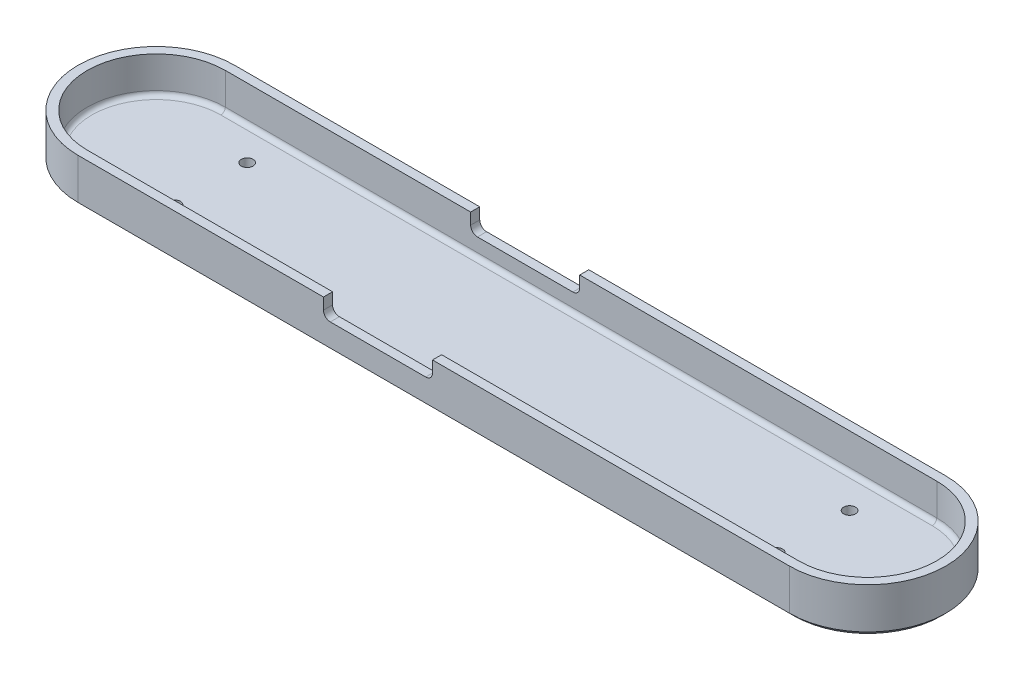
ISO-10303-21;
HEADER;
FILE_DESCRIPTION(('STEP AP214'),'2;1');
FILE_NAME('part.step','',(''),(''),'','','');
FILE_SCHEMA(('AUTOMOTIVE_DESIGN { 1 0 10303 214 1 1 1 1 }'));
ENDSEC;
DATA;
#1=APPLICATION_CONTEXT('core data for automotive mechanical design processes');
#2=APPLICATION_PROTOCOL_DEFINITION('international standard','automotive_design',2000,#1);
#3=PRODUCT_CONTEXT('',#1,'mechanical');
#4=PRODUCT('Part','Part','',(#3));
#5=PRODUCT_RELATED_PRODUCT_CATEGORY('part','',(#4));
#6=PRODUCT_DEFINITION_FORMATION('','',#4);
#7=PRODUCT_DEFINITION_CONTEXT('part definition',#1,'design');
#8=PRODUCT_DEFINITION('design','',#6,#7);
#9=PRODUCT_DEFINITION_SHAPE('','',#8);
#10=(LENGTH_UNIT() NAMED_UNIT(*) SI_UNIT(.MILLI.,.METRE.));
#11=(NAMED_UNIT(*) PLANE_ANGLE_UNIT() SI_UNIT($,.RADIAN.));
#12=(NAMED_UNIT(*) SI_UNIT($,.STERADIAN.) SOLID_ANGLE_UNIT());
#13=UNCERTAINTY_MEASURE_WITH_UNIT(LENGTH_MEASURE(1.E-05),#10,'distance_accuracy_value','');
#14=(GEOMETRIC_REPRESENTATION_CONTEXT(3) GLOBAL_UNCERTAINTY_ASSIGNED_CONTEXT((#13)) GLOBAL_UNIT_ASSIGNED_CONTEXT((#10,
#11,#12)) REPRESENTATION_CONTEXT('',''));
#15=CARTESIAN_POINT('',(0.,0.,0.));
#16=DIRECTION('',(0.,0.,1.));
#17=DIRECTION('',(1.,0.,0.));
#18=AXIS2_PLACEMENT_3D('',#15,#16,#17);
#19=CARTESIAN_POINT('',(-99.441,12.7,21.844));
#20=DIRECTION('',(0.,0.,1.));
#21=DIRECTION('',(1.,0.,0.));
#22=AXIS2_PLACEMENT_3D('',#19,#20,#21);
#23=PLANE('',#22);
#24=DIRECTION('',(0.,1.,0.));
#25=VECTOR('',#24,1.);
#26=CARTESIAN_POINT('',(-0.380999999999999,7.62,21.844));
#27=LINE('',#26,#25);
#28=CARTESIAN_POINT('',(-0.380999999999999,9.525,21.844));
#29=VERTEX_POINT('',#28);
#30=CARTESIAN_POINT('',(-0.380999999999999,12.7,21.844));
#31=VERTEX_POINT('',#30);
#32=EDGE_CURVE('E210',#29,#31,#27,.T.);
#33=ORIENTED_EDGE('',*,*,#32,.F.);
#34=CARTESIAN_POINT('',(-2.286,9.525,21.844));
#35=DIRECTION('',(0.,0.,1.));
#36=DIRECTION('',(1.,0.,0.));
#37=AXIS2_PLACEMENT_3D('',#34,#35,#36);
#38=CIRCLE('',#37,1.905);
#39=CARTESIAN_POINT('',(-2.286,7.62,21.844));
#40=VERTEX_POINT('',#39);
#41=EDGE_CURVE('E373',#29,#40,#38,.F.);
#42=ORIENTED_EDGE('',*,*,#41,.T.);
#43=DIRECTION('',(-1.,0.,0.));
#44=VECTOR('',#43,1.);
#45=CARTESIAN_POINT('',(-0.380999999999999,7.62,21.844));
#46=LINE('',#45,#44);
#47=CARTESIAN_POINT('',(-28.956,7.62,21.844));
#48=VERTEX_POINT('',#47);
#49=EDGE_CURVE('E550',#40,#48,#46,.T.);
#50=ORIENTED_EDGE('',*,*,#49,.T.);
#51=CARTESIAN_POINT('',(-28.956,9.525,21.844));
#52=DIRECTION('',(0.,0.,1.));
#53=DIRECTION('',(1.,0.,0.));
#54=AXIS2_PLACEMENT_3D('',#51,#52,#53);
#55=CIRCLE('',#54,1.905);
#56=CARTESIAN_POINT('',(-30.861,9.525,21.844));
#57=VERTEX_POINT('',#56);
#58=EDGE_CURVE('E370',#48,#57,#55,.F.);
#59=ORIENTED_EDGE('',*,*,#58,.T.);
#60=DIRECTION('',(0.,1.,0.));
#61=VECTOR('',#60,1.);
#62=CARTESIAN_POINT('',(-30.861,7.62,21.844));
#63=LINE('',#62,#61);
#64=CARTESIAN_POINT('',(-30.861,12.7,21.844));
#65=VERTEX_POINT('',#64);
#66=EDGE_CURVE('E537',#57,#65,#63,.T.);
#67=ORIENTED_EDGE('',*,*,#66,.T.);
#68=DIRECTION('',(-1.,0.,0.));
#69=VECTOR('',#68,1.);
#70=CARTESIAN_POINT('',(-99.441,12.7,21.844));
#71=LINE('',#70,#69);
#72=CARTESIAN_POINT('',(-99.441,12.7,21.844));
#73=VERTEX_POINT('',#72);
#74=EDGE_CURVE('E241',#65,#73,#71,.T.);
#75=ORIENTED_EDGE('',*,*,#74,.T.);
#76=DIRECTION('',(0.,-1.,0.));
#77=VECTOR('',#76,1.);
#78=CARTESIAN_POINT('',(-99.441,12.7,21.844));
#79=LINE('',#78,#77);
#80=CARTESIAN_POINT('',(-99.441,1.26999999999999,21.844));
#81=VERTEX_POINT('',#80);
#82=EDGE_CURVE('E252',#73,#81,#79,.T.);
#83=ORIENTED_EDGE('',*,*,#82,.T.);
#84=DIRECTION('',(1.,0.,0.));
#85=VECTOR('',#84,1.);
#86=CARTESIAN_POINT('',(99.441,1.26999999999999,21.844));
#87=LINE('',#86,#85);
#88=CARTESIAN_POINT('',(99.441,1.26999999999999,21.844));
#89=VERTEX_POINT('',#88);
#90=EDGE_CURVE('E316',#81,#89,#87,.T.);
#91=ORIENTED_EDGE('',*,*,#90,.T.);
#92=DIRECTION('',(0.,-1.,0.));
#93=VECTOR('',#92,1.);
#94=CARTESIAN_POINT('',(99.441,12.7,21.844));
#95=LINE('',#94,#93);
#96=CARTESIAN_POINT('',(99.441,12.7,21.844));
#97=VERTEX_POINT('',#96);
#98=EDGE_CURVE('E237',#97,#89,#95,.T.);
#99=ORIENTED_EDGE('',*,*,#98,.F.);
#100=EDGE_CURVE('E228',#97,#31,#71,.T.);
#101=ORIENTED_EDGE('',*,*,#100,.T.);
#102=EDGE_LOOP('',(#33,#42,#50,#59,#67,#75,#83,#91,#99,#101));
#103=FACE_BOUND('',#102,.T.);
#104=ADVANCED_FACE('F49',(#103),#23,.T.);
#105=CARTESIAN_POINT('',(-99.441,12.7,0.));
#106=DIRECTION('',(0.,-1.,0.));
#107=DIRECTION('',(0.,0.,-1.));
#108=AXIS2_PLACEMENT_3D('',#105,#106,#107);
#109=PLANE('',#108);
#110=DIRECTION('',(0.,0.,-1.));
#111=VECTOR('',#110,1.);
#112=CARTESIAN_POINT('',(-30.861,12.7,21.844));
#113=LINE('',#112,#111);
#114=CARTESIAN_POINT('',(-30.861,12.7,19.304));
#115=VERTEX_POINT('',#114);
#116=EDGE_CURVE('E233',#65,#115,#113,.T.);
#117=ORIENTED_EDGE('',*,*,#116,.T.);
#118=DIRECTION('',(-1.,0.,0.));
#119=VECTOR('',#118,1.);
#120=CARTESIAN_POINT('',(99.441,12.7,19.304));
#121=LINE('',#120,#119);
#122=CARTESIAN_POINT('',(-99.441,12.7,19.304));
#123=VERTEX_POINT('',#122);
#124=EDGE_CURVE('E469',#115,#123,#121,.T.);
#125=ORIENTED_EDGE('',*,*,#124,.T.);
#126=CARTESIAN_POINT('',(-99.441,12.7,0.));
#127=DIRECTION('',(0.,-1.,0.));
#128=DIRECTION('',(0.,0.,-1.));
#129=AXIS2_PLACEMENT_3D('',#126,#127,#128);
#130=CIRCLE('',#129,19.304);
#131=CARTESIAN_POINT('',(-99.441,12.7,-19.304));
#132=VERTEX_POINT('',#131);
#133=EDGE_CURVE('E457',#123,#132,#130,.T.);
#134=ORIENTED_EDGE('',*,*,#133,.T.);
#135=DIRECTION('',(1.,0.,0.));
#136=VECTOR('',#135,1.);
#137=CARTESIAN_POINT('',(99.441,12.7,-19.304));
#138=LINE('',#137,#136);
#139=CARTESIAN_POINT('',(-30.861,12.7,-19.304));
#140=VERTEX_POINT('',#139);
#141=EDGE_CURVE('E462',#132,#140,#138,.T.);
#142=ORIENTED_EDGE('',*,*,#141,.T.);
#143=DIRECTION('',(0.,0.,1.));
#144=VECTOR('',#143,1.);
#145=CARTESIAN_POINT('',(-30.861,12.7,-21.844));
#146=LINE('',#145,#144);
#147=CARTESIAN_POINT('',(-30.861,12.7,-21.844));
#148=VERTEX_POINT('',#147);
#149=EDGE_CURVE('E534',#148,#140,#146,.T.);
#150=ORIENTED_EDGE('',*,*,#149,.F.);
#151=DIRECTION('',(1.,0.,0.));
#152=VECTOR('',#151,1.);
#153=CARTESIAN_POINT('',(-99.441,12.7,-21.844));
#154=LINE('',#153,#152);
#155=CARTESIAN_POINT('',(-99.441,12.7,-21.844));
#156=VERTEX_POINT('',#155);
#157=EDGE_CURVE('E492',#156,#148,#154,.T.);
#158=ORIENTED_EDGE('',*,*,#157,.F.);
#159=CARTESIAN_POINT('',(-99.441,12.7,0.));
#160=DIRECTION('',(0.,-1.,0.));
#161=DIRECTION('',(0.,0.,-1.));
#162=AXIS2_PLACEMENT_3D('',#159,#160,#161);
#163=CIRCLE('',#162,21.844);
#164=EDGE_CURVE('E477',#73,#156,#163,.T.);
#165=ORIENTED_EDGE('',*,*,#164,.F.);
#166=ORIENTED_EDGE('',*,*,#74,.F.);
#167=EDGE_LOOP('',(#117,#125,#134,#142,#150,#158,#165,#166));
#168=FACE_BOUND('',#167,.T.);
#169=ADVANCED_FACE('F531',(#168),#109,.F.);
#170=DIRECTION('',(0.,0.,1.));
#171=VECTOR('',#170,1.);
#172=CARTESIAN_POINT('',(-0.381000000000006,12.7,19.304));
#173=LINE('',#172,#171);
#174=CARTESIAN_POINT('',(-0.381000000000006,12.7,19.304));
#175=VERTEX_POINT('',#174);
#176=EDGE_CURVE('E214',#175,#31,#173,.T.);
#177=ORIENTED_EDGE('',*,*,#176,.T.);
#178=ORIENTED_EDGE('',*,*,#100,.F.);
#179=CARTESIAN_POINT('',(99.441,12.7,0.));
#180=DIRECTION('',(0.,-1.,0.));
#181=DIRECTION('',(0.,0.,1.));
#182=AXIS2_PLACEMENT_3D('',#179,#180,#181);
#183=CIRCLE('',#182,21.844);
#184=CARTESIAN_POINT('',(99.441,12.7,-21.844));
#185=VERTEX_POINT('',#184);
#186=EDGE_CURVE('E248',#185,#97,#183,.T.);
#187=ORIENTED_EDGE('',*,*,#186,.F.);
#188=CARTESIAN_POINT('',(-0.380999999999999,12.7,-21.844));
#189=VERTEX_POINT('',#188);
#190=EDGE_CURVE('E491',#189,#185,#154,.T.);
#191=ORIENTED_EDGE('',*,*,#190,.F.);
#192=DIRECTION('',(0.,0.,-1.));
#193=VECTOR('',#192,1.);
#194=CARTESIAN_POINT('',(-0.381000000000006,12.7,-19.304));
#195=LINE('',#194,#193);
#196=CARTESIAN_POINT('',(-0.381000000000006,12.7,-19.304));
#197=VERTEX_POINT('',#196);
#198=EDGE_CURVE('E412',#197,#189,#195,.T.);
#199=ORIENTED_EDGE('',*,*,#198,.F.);
#200=CARTESIAN_POINT('',(99.441,12.7,-19.304));
#201=VERTEX_POINT('',#200);
#202=EDGE_CURVE('E461',#197,#201,#138,.T.);
#203=ORIENTED_EDGE('',*,*,#202,.T.);
#204=CARTESIAN_POINT('',(99.441,12.7,0.));
#205=DIRECTION('',(0.,-1.,0.));
#206=DIRECTION('',(0.,0.,1.));
#207=AXIS2_PLACEMENT_3D('',#204,#205,#206);
#208=CIRCLE('',#207,19.304);
#209=CARTESIAN_POINT('',(99.441,12.7,19.304));
#210=VERTEX_POINT('',#209);
#211=EDGE_CURVE('E466',#201,#210,#208,.T.);
#212=ORIENTED_EDGE('',*,*,#211,.T.);
#213=EDGE_CURVE('E231',#210,#175,#121,.T.);
#214=ORIENTED_EDGE('',*,*,#213,.T.);
#215=EDGE_LOOP('',(#177,#178,#187,#191,#199,#203,#212,#214));
#216=FACE_BOUND('',#215,.T.);
#217=ADVANCED_FACE('F226',(#216),#109,.F.);
#218=CARTESIAN_POINT('',(99.441,12.7,19.304));
#219=DIRECTION('',(0.,0.,1.));
#220=DIRECTION('',(1.,0.,0.));
#221=AXIS2_PLACEMENT_3D('',#218,#219,#220);
#222=PLANE('',#221);
#223=DIRECTION('',(0.,1.,0.));
#224=VECTOR('',#223,1.);
#225=CARTESIAN_POINT('',(-30.861,7.62,19.304));
#226=LINE('',#225,#224);
#227=CARTESIAN_POINT('',(-30.861,9.525,19.304));
#228=VERTEX_POINT('',#227);
#229=EDGE_CURVE('E540',#228,#115,#226,.T.);
#230=ORIENTED_EDGE('',*,*,#229,.F.);
#231=CARTESIAN_POINT('',(-28.956,9.525,19.304));
#232=DIRECTION('',(0.,0.,1.));
#233=DIRECTION('',(1.,0.,0.));
#234=AXIS2_PLACEMENT_3D('',#231,#232,#233);
#235=CIRCLE('',#234,1.905);
#236=CARTESIAN_POINT('',(-28.956,7.62,19.304));
#237=VERTEX_POINT('',#236);
#238=EDGE_CURVE('E367',#228,#237,#235,.T.);
#239=ORIENTED_EDGE('',*,*,#238,.T.);
#240=DIRECTION('',(1.,0.,0.));
#241=VECTOR('',#240,1.);
#242=CARTESIAN_POINT('',(-30.861,7.62,19.304));
#243=LINE('',#242,#241);
#244=CARTESIAN_POINT('',(-2.28600000000001,7.62,19.304));
#245=VERTEX_POINT('',#244);
#246=EDGE_CURVE('E222',#237,#245,#243,.T.);
#247=ORIENTED_EDGE('',*,*,#246,.T.);
#248=CARTESIAN_POINT('',(-2.28600000000001,9.525,19.304));
#249=DIRECTION('',(0.,0.,1.));
#250=DIRECTION('',(1.,0.,0.));
#251=AXIS2_PLACEMENT_3D('',#248,#249,#250);
#252=CIRCLE('',#251,1.905);
#253=CARTESIAN_POINT('',(-0.381000000000006,9.525,19.304));
#254=VERTEX_POINT('',#253);
#255=EDGE_CURVE('E376',#245,#254,#252,.T.);
#256=ORIENTED_EDGE('',*,*,#255,.T.);
#257=DIRECTION('',(0.,1.,0.));
#258=VECTOR('',#257,1.);
#259=CARTESIAN_POINT('',(-0.381000000000006,7.62,19.304));
#260=LINE('',#259,#258);
#261=EDGE_CURVE('E221',#254,#175,#260,.T.);
#262=ORIENTED_EDGE('',*,*,#261,.T.);
#263=ORIENTED_EDGE('',*,*,#213,.F.);
#264=DIRECTION('',(0.,-1.,0.));
#265=VECTOR('',#264,1.);
#266=CARTESIAN_POINT('',(99.441,12.7,19.304));
#267=LINE('',#266,#265);
#268=CARTESIAN_POINT('',(99.441,3.81,19.304));
#269=VERTEX_POINT('',#268);
#270=EDGE_CURVE('E478',#210,#269,#267,.T.);
#271=ORIENTED_EDGE('',*,*,#270,.T.);
#272=DIRECTION('',(1.,0.,0.));
#273=VECTOR('',#272,1.);
#274=CARTESIAN_POINT('',(99.441,3.81,19.304));
#275=LINE('',#274,#273);
#276=CARTESIAN_POINT('',(-99.441,3.81,19.304));
#277=VERTEX_POINT('',#276);
#278=EDGE_CURVE('E278',#269,#277,#275,.F.);
#279=ORIENTED_EDGE('',*,*,#278,.T.);
#280=DIRECTION('',(0.,-1.,0.));
#281=VECTOR('',#280,1.);
#282=CARTESIAN_POINT('',(-99.441,12.7,19.304));
#283=LINE('',#282,#281);
#284=EDGE_CURVE('E473',#123,#277,#283,.T.);
#285=ORIENTED_EDGE('',*,*,#284,.F.);
#286=ORIENTED_EDGE('',*,*,#124,.F.);
#287=EDGE_LOOP('',(#230,#239,#247,#256,#262,#263,#271,#279,#285,#286));
#288=FACE_BOUND('',#287,.T.);
#289=ADVANCED_FACE('F572',(#288),#222,.F.);
#290=CARTESIAN_POINT('',(-99.441,2.54,0.));
#291=DIRECTION('',(0.,1.,0.));
#292=DIRECTION('',(0.,0.,1.));
#293=AXIS2_PLACEMENT_3D('',#290,#291,#292);
#294=PLANE('',#293);
#295=DIRECTION('',(1.,0.,0.));
#296=VECTOR('',#295,1.);
#297=CARTESIAN_POINT('',(-99.441,2.54,18.034));
#298=LINE('',#297,#296);
#299=CARTESIAN_POINT('',(-99.441,2.54,18.034));
#300=VERTEX_POINT('',#299);
#301=CARTESIAN_POINT('',(99.441,2.54,18.034));
#302=VERTEX_POINT('',#301);
#303=EDGE_CURVE('E267',#300,#302,#298,.T.);
#304=ORIENTED_EDGE('',*,*,#303,.T.);
#305=CARTESIAN_POINT('',(99.441,2.54,0.));
#306=DIRECTION('',(0.,1.,0.));
#307=DIRECTION('',(0.,0.,1.));
#308=AXIS2_PLACEMENT_3D('',#305,#306,#307);
#309=CIRCLE('',#308,18.034);
#310=CARTESIAN_POINT('',(99.441,2.54,-18.034));
#311=VERTEX_POINT('',#310);
#312=EDGE_CURVE('E270',#302,#311,#309,.T.);
#313=ORIENTED_EDGE('',*,*,#312,.T.);
#314=DIRECTION('',(-1.,0.,0.));
#315=VECTOR('',#314,1.);
#316=CARTESIAN_POINT('',(-99.441,2.54,-18.034));
#317=LINE('',#316,#315);
#318=CARTESIAN_POINT('',(-99.441,2.54,-18.034));
#319=VERTEX_POINT('',#318);
#320=EDGE_CURVE('E256',#311,#319,#317,.T.);
#321=ORIENTED_EDGE('',*,*,#320,.T.);
#322=CARTESIAN_POINT('',(-99.441,2.54,0.));
#323=DIRECTION('',(0.,1.,0.));
#324=DIRECTION('',(0.,0.,1.));
#325=AXIS2_PLACEMENT_3D('',#322,#323,#324);
#326=CIRCLE('',#325,18.034);
#327=EDGE_CURVE('E264',#319,#300,#326,.T.);
#328=ORIENTED_EDGE('',*,*,#327,.T.);
#329=EDGE_LOOP('',(#304,#313,#321,#328));
#330=FACE_BOUND('',#329,.T.);
#331=CARTESIAN_POINT('',(-84.201,2.54,-10.16));
#332=DIRECTION('',(0.,1.,0.));
#333=DIRECTION('',(0.,0.,1.));
#334=AXIS2_PLACEMENT_3D('',#331,#332,#333);
#335=CIRCLE('',#334,1.65100000000001);
#336=CARTESIAN_POINT('',(-84.201,2.54,-8.509));
#337=VERTEX_POINT('',#336);
#338=EDGE_CURVE('E453',#337,#337,#335,.T.);
#339=ORIENTED_EDGE('',*,*,#338,.F.);
#340=EDGE_LOOP('',(#339));
#341=FACE_BOUND('',#340,.T.);
#342=CARTESIAN_POINT('',(84.201,2.54,-10.16));
#343=DIRECTION('',(0.,1.,0.));
#344=DIRECTION('',(0.,0.,1.));
#345=AXIS2_PLACEMENT_3D('',#342,#343,#344);
#346=CIRCLE('',#345,1.65100000000001);
#347=CARTESIAN_POINT('',(84.201,2.54,-8.509));
#348=VERTEX_POINT('',#347);
#349=EDGE_CURVE('E449',#348,#348,#346,.T.);
#350=ORIENTED_EDGE('',*,*,#349,.F.);
#351=EDGE_LOOP('',(#350));
#352=FACE_BOUND('',#351,.T.);
#353=CARTESIAN_POINT('',(84.201,2.54,10.16));
#354=DIRECTION('',(0.,1.,0.));
#355=DIRECTION('',(0.,0.,1.));
#356=AXIS2_PLACEMENT_3D('',#353,#354,#355);
#357=CIRCLE('',#356,1.65100000000001);
#358=CARTESIAN_POINT('',(84.201,2.54,11.811));
#359=VERTEX_POINT('',#358);
#360=EDGE_CURVE('E445',#359,#359,#357,.T.);
#361=ORIENTED_EDGE('',*,*,#360,.F.);
#362=EDGE_LOOP('',(#361));
#363=FACE_BOUND('',#362,.T.);
#364=CARTESIAN_POINT('',(-84.201,2.54,10.16));
#365=DIRECTION('',(0.,1.,0.));
#366=DIRECTION('',(0.,0.,1.));
#367=AXIS2_PLACEMENT_3D('',#364,#365,#366);
#368=CIRCLE('',#367,1.65100000000001);
#369=CARTESIAN_POINT('',(-84.201,2.54,11.811));
#370=VERTEX_POINT('',#369);
#371=EDGE_CURVE('E441',#370,#370,#368,.T.);
#372=ORIENTED_EDGE('',*,*,#371,.F.);
#373=EDGE_LOOP('',(#372));
#374=FACE_BOUND('',#373,.T.);
#375=ADVANCED_FACE('F624',(#330,#341,#352,#363,#374),#294,.T.);
#376=CARTESIAN_POINT('',(-99.441,12.7,0.));
#377=DIRECTION('',(0.,-1.,0.));
#378=DIRECTION('',(0.,0.,-1.));
#379=AXIS2_PLACEMENT_3D('',#376,#377,#378);
#380=CYLINDRICAL_SURFACE('',#379,21.844);
#381=DIRECTION('',(0.,-1.,0.));
#382=VECTOR('',#381,1.);
#383=CARTESIAN_POINT('',(-99.441,12.7,-21.844));
#384=LINE('',#383,#382);
#385=CARTESIAN_POINT('',(-99.441,1.26999999999999,-21.844));
#386=VERTEX_POINT('',#385);
#387=EDGE_CURVE('E240',#156,#386,#384,.T.);
#388=ORIENTED_EDGE('',*,*,#387,.T.);
#389=CARTESIAN_POINT('',(-99.441,1.26999999999999,0.));
#390=DIRECTION('',(0.,1.,0.));
#391=DIRECTION('',(0.,0.,1.));
#392=AXIS2_PLACEMENT_3D('',#389,#390,#391);
#393=CIRCLE('',#392,21.844);
#394=EDGE_CURVE('E319',#386,#81,#393,.T.);
#395=ORIENTED_EDGE('',*,*,#394,.T.);
#396=ORIENTED_EDGE('',*,*,#82,.F.);
#397=ORIENTED_EDGE('',*,*,#164,.T.);
#398=EDGE_LOOP('',(#388,#395,#396,#397));
#399=FACE_BOUND('',#398,.T.);
#400=ADVANCED_FACE('F526',(#399),#380,.T.);
#401=CARTESIAN_POINT('',(99.441,12.7,0.));
#402=DIRECTION('',(0.,-1.,0.));
#403=DIRECTION('',(0.,0.,-1.));
#404=AXIS2_PLACEMENT_3D('',#401,#402,#403);
#405=CYLINDRICAL_SURFACE('',#404,21.844);
#406=ORIENTED_EDGE('',*,*,#98,.T.);
#407=CARTESIAN_POINT('',(99.441,1.26999999999999,0.));
#408=DIRECTION('',(0.,1.,0.));
#409=DIRECTION('',(0.,0.,1.));
#410=AXIS2_PLACEMENT_3D('',#407,#408,#409);
#411=CIRCLE('',#410,21.844);
#412=CARTESIAN_POINT('',(99.441,1.26999999999999,-21.844));
#413=VERTEX_POINT('',#412);
#414=EDGE_CURVE('E322',#89,#413,#411,.T.);
#415=ORIENTED_EDGE('',*,*,#414,.T.);
#416=DIRECTION('',(0.,-1.,0.));
#417=VECTOR('',#416,1.);
#418=CARTESIAN_POINT('',(99.441,12.7,-21.844));
#419=LINE('',#418,#417);
#420=EDGE_CURVE('E246',#185,#413,#419,.T.);
#421=ORIENTED_EDGE('',*,*,#420,.F.);
#422=ORIENTED_EDGE('',*,*,#186,.T.);
#423=EDGE_LOOP('',(#406,#415,#421,#422));
#424=FACE_BOUND('',#423,.T.);
#425=ADVANCED_FACE('F501',(#424),#405,.T.);
#426=CARTESIAN_POINT('',(-99.441,12.7,-21.844));
#427=DIRECTION('',(0.,0.,-1.));
#428=DIRECTION('',(-1.,0.,0.));
#429=AXIS2_PLACEMENT_3D('',#426,#427,#428);
#430=PLANE('',#429);
#431=DIRECTION('',(-1.,0.,0.));
#432=VECTOR('',#431,1.);
#433=CARTESIAN_POINT('',(-0.380999999999999,7.62,-21.844));
#434=LINE('',#433,#432);
#435=CARTESIAN_POINT('',(-2.286,7.62,-21.844));
#436=VERTEX_POINT('',#435);
#437=CARTESIAN_POINT('',(-28.956,7.62,-21.844));
#438=VERTEX_POINT('',#437);
#439=EDGE_CURVE('E402',#436,#438,#434,.T.);
#440=ORIENTED_EDGE('',*,*,#439,.F.);
#441=CARTESIAN_POINT('',(-2.286,9.525,-21.844));
#442=DIRECTION('',(0.,0.,-1.));
#443=DIRECTION('',(-1.,0.,0.));
#444=AXIS2_PLACEMENT_3D('',#441,#442,#443);
#445=CIRCLE('',#444,1.905);
#446=CARTESIAN_POINT('',(-0.380999999999999,9.525,-21.844));
#447=VERTEX_POINT('',#446);
#448=EDGE_CURVE('E379',#436,#447,#445,.F.);
#449=ORIENTED_EDGE('',*,*,#448,.T.);
#450=DIRECTION('',(0.,1.,0.));
#451=VECTOR('',#450,1.);
#452=CARTESIAN_POINT('',(-0.380999999999999,7.62,-21.844));
#453=LINE('',#452,#451);
#454=EDGE_CURVE('E333',#447,#189,#453,.T.);
#455=ORIENTED_EDGE('',*,*,#454,.T.);
#456=ORIENTED_EDGE('',*,*,#190,.T.);
#457=ORIENTED_EDGE('',*,*,#420,.T.);
#458=DIRECTION('',(-1.,0.,0.));
#459=VECTOR('',#458,1.);
#460=CARTESIAN_POINT('',(-99.441,1.26999999999999,-21.844));
#461=LINE('',#460,#459);
#462=EDGE_CURVE('E325',#413,#386,#461,.T.);
#463=ORIENTED_EDGE('',*,*,#462,.T.);
#464=ORIENTED_EDGE('',*,*,#387,.F.);
#465=ORIENTED_EDGE('',*,*,#157,.T.);
#466=DIRECTION('',(0.,1.,0.));
#467=VECTOR('',#466,1.);
#468=CARTESIAN_POINT('',(-30.861,7.62,-21.844));
#469=LINE('',#468,#467);
#470=CARTESIAN_POINT('',(-30.861,9.525,-21.844));
#471=VERTEX_POINT('',#470);
#472=EDGE_CURVE('E401',#471,#148,#469,.T.);
#473=ORIENTED_EDGE('',*,*,#472,.F.);
#474=CARTESIAN_POINT('',(-28.956,9.525,-21.844));
#475=DIRECTION('',(0.,0.,-1.));
#476=DIRECTION('',(-1.,0.,0.));
#477=AXIS2_PLACEMENT_3D('',#474,#475,#476);
#478=CIRCLE('',#477,1.905);
#479=EDGE_CURVE('E11',#471,#438,#478,.F.);
#480=ORIENTED_EDGE('',*,*,#479,.T.);
#481=EDGE_LOOP('',(#440,#449,#455,#456,#457,#463,#464,#465,#473,#480));
#482=FACE_BOUND('',#481,.T.);
#483=ADVANCED_FACE('F407',(#482),#430,.T.);
#484=CARTESIAN_POINT('',(-99.441,12.7,0.));
#485=DIRECTION('',(0.,-1.,0.));
#486=DIRECTION('',(0.,0.,-1.));
#487=AXIS2_PLACEMENT_3D('',#484,#485,#486);
#488=CYLINDRICAL_SURFACE('',#487,19.304);
#489=ORIENTED_EDGE('',*,*,#284,.T.);
#490=CARTESIAN_POINT('',(-99.441,3.81,0.));
#491=DIRECTION('',(0.,1.,0.));
#492=DIRECTION('',(0.,0.,1.));
#493=AXIS2_PLACEMENT_3D('',#490,#491,#492);
#494=CIRCLE('',#493,19.304);
#495=CARTESIAN_POINT('',(-99.441,3.81,-19.304));
#496=VERTEX_POINT('',#495);
#497=EDGE_CURVE('E281',#277,#496,#494,.F.);
#498=ORIENTED_EDGE('',*,*,#497,.T.);
#499=DIRECTION('',(0.,-1.,0.));
#500=VECTOR('',#499,1.);
#501=CARTESIAN_POINT('',(-99.441,12.7,-19.304));
#502=LINE('',#501,#500);
#503=EDGE_CURVE('E472',#132,#496,#502,.T.);
#504=ORIENTED_EDGE('',*,*,#503,.F.);
#505=ORIENTED_EDGE('',*,*,#133,.F.);
#506=EDGE_LOOP('',(#489,#498,#504,#505));
#507=FACE_BOUND('',#506,.T.);
#508=ADVANCED_FACE('F621',(#507),#488,.F.);
#509=CARTESIAN_POINT('',(99.441,12.7,0.));
#510=DIRECTION('',(0.,-1.,0.));
#511=DIRECTION('',(0.,0.,-1.));
#512=AXIS2_PLACEMENT_3D('',#509,#510,#511);
#513=CYLINDRICAL_SURFACE('',#512,19.304);
#514=DIRECTION('',(0.,-1.,0.));
#515=VECTOR('',#514,1.);
#516=CARTESIAN_POINT('',(99.441,12.7,-19.304));
#517=LINE('',#516,#515);
#518=CARTESIAN_POINT('',(99.441,3.81,-19.304));
#519=VERTEX_POINT('',#518);
#520=EDGE_CURVE('E482',#201,#519,#517,.T.);
#521=ORIENTED_EDGE('',*,*,#520,.T.);
#522=CARTESIAN_POINT('',(99.441,3.81,0.));
#523=DIRECTION('',(0.,1.,0.));
#524=DIRECTION('',(0.,0.,1.));
#525=AXIS2_PLACEMENT_3D('',#522,#523,#524);
#526=CIRCLE('',#525,19.304);
#527=EDGE_CURVE('E274',#519,#269,#526,.F.);
#528=ORIENTED_EDGE('',*,*,#527,.T.);
#529=ORIENTED_EDGE('',*,*,#270,.F.);
#530=ORIENTED_EDGE('',*,*,#211,.F.);
#531=EDGE_LOOP('',(#521,#528,#529,#530));
#532=FACE_BOUND('',#531,.T.);
#533=ADVANCED_FACE('F581',(#532),#513,.F.);
#534=CARTESIAN_POINT('',(99.441,12.7,-19.304));
#535=DIRECTION('',(0.,0.,-1.));
#536=DIRECTION('',(-1.,0.,0.));
#537=AXIS2_PLACEMENT_3D('',#534,#535,#536);
#538=PLANE('',#537);
#539=ORIENTED_EDGE('',*,*,#202,.F.);
#540=DIRECTION('',(0.,1.,0.));
#541=VECTOR('',#540,1.);
#542=CARTESIAN_POINT('',(-0.381000000000006,7.62,-19.304));
#543=LINE('',#542,#541);
#544=CARTESIAN_POINT('',(-0.381000000000006,9.525,-19.304));
#545=VERTEX_POINT('',#544);
#546=EDGE_CURVE('E391',#545,#197,#543,.T.);
#547=ORIENTED_EDGE('',*,*,#546,.F.);
#548=CARTESIAN_POINT('',(-2.28600000000001,9.525,-19.304));
#549=DIRECTION('',(0.,0.,-1.));
#550=DIRECTION('',(-1.,0.,0.));
#551=AXIS2_PLACEMENT_3D('',#548,#549,#550);
#552=CIRCLE('',#551,1.905);
#553=CARTESIAN_POINT('',(-2.28600000000001,7.62,-19.304));
#554=VERTEX_POINT('',#553);
#555=EDGE_CURVE('E382',#545,#554,#552,.T.);
#556=ORIENTED_EDGE('',*,*,#555,.T.);
#557=DIRECTION('',(1.,0.,0.));
#558=VECTOR('',#557,1.);
#559=CARTESIAN_POINT('',(-30.861,7.62,-19.304));
#560=LINE('',#559,#558);
#561=CARTESIAN_POINT('',(-28.956,7.62,-19.304));
#562=VERTEX_POINT('',#561);
#563=EDGE_CURVE('E390',#562,#554,#560,.T.);
#564=ORIENTED_EDGE('',*,*,#563,.F.);
#565=CARTESIAN_POINT('',(-28.956,9.525,-19.304));
#566=DIRECTION('',(0.,0.,-1.));
#567=DIRECTION('',(-1.,0.,0.));
#568=AXIS2_PLACEMENT_3D('',#565,#566,#567);
#569=CIRCLE('',#568,1.905);
#570=CARTESIAN_POINT('',(-30.861,9.525,-19.304));
#571=VERTEX_POINT('',#570);
#572=EDGE_CURVE('E58',#562,#571,#569,.T.);
#573=ORIENTED_EDGE('',*,*,#572,.T.);
#574=DIRECTION('',(0.,1.,0.));
#575=VECTOR('',#574,1.);
#576=CARTESIAN_POINT('',(-30.861,7.62,-19.304));
#577=LINE('',#576,#575);
#578=EDGE_CURVE('E417',#571,#140,#577,.T.);
#579=ORIENTED_EDGE('',*,*,#578,.T.);
#580=ORIENTED_EDGE('',*,*,#141,.F.);
#581=ORIENTED_EDGE('',*,*,#503,.T.);
#582=DIRECTION('',(-1.,0.,0.));
#583=VECTOR('',#582,1.);
#584=CARTESIAN_POINT('',(99.441,3.81,-19.304));
#585=LINE('',#584,#583);
#586=EDGE_CURVE('E284',#496,#519,#585,.F.);
#587=ORIENTED_EDGE('',*,*,#586,.T.);
#588=ORIENTED_EDGE('',*,*,#520,.F.);
#589=EDGE_LOOP('',(#539,#547,#556,#564,#573,#579,#580,#581,#587,#588));
#590=FACE_BOUND('',#589,.T.);
#591=ADVANCED_FACE('F389',(#590),#538,.F.);
#592=CARTESIAN_POINT('',(-99.441,0.,0.));
#593=DIRECTION('',(0.,1.,0.));
#594=DIRECTION('',(0.,0.,1.));
#595=AXIS2_PLACEMENT_3D('',#592,#593,#594);
#596=PLANE('',#595);
#597=CARTESIAN_POINT('',(99.441,0.,0.));
#598=DIRECTION('',(0.,1.,0.));
#599=DIRECTION('',(0.,0.,1.));
#600=AXIS2_PLACEMENT_3D('',#597,#598,#599);
#601=CIRCLE('',#600,20.574);
#602=CARTESIAN_POINT('',(99.441,0.,-20.574));
#603=VERTEX_POINT('',#602);
#604=CARTESIAN_POINT('',(99.441,0.,20.574));
#605=VERTEX_POINT('',#604);
#606=EDGE_CURVE('E306',#603,#605,#601,.F.);
#607=ORIENTED_EDGE('',*,*,#606,.T.);
#608=DIRECTION('',(-1.,0.,0.));
#609=VECTOR('',#608,1.);
#610=CARTESIAN_POINT('',(-99.441,0.,20.574));
#611=LINE('',#610,#609);
#612=CARTESIAN_POINT('',(-99.441,0.,20.574));
#613=VERTEX_POINT('',#612);
#614=EDGE_CURVE('E312',#605,#613,#611,.T.);
#615=ORIENTED_EDGE('',*,*,#614,.T.);
#616=CARTESIAN_POINT('',(-99.441,0.,0.));
#617=DIRECTION('',(0.,1.,0.));
#618=DIRECTION('',(0.,0.,1.));
#619=AXIS2_PLACEMENT_3D('',#616,#617,#618);
#620=CIRCLE('',#619,20.574);
#621=CARTESIAN_POINT('',(-99.441,0.,-20.574));
#622=VERTEX_POINT('',#621);
#623=EDGE_CURVE('E309',#613,#622,#620,.F.);
#624=ORIENTED_EDGE('',*,*,#623,.T.);
#625=DIRECTION('',(1.,0.,0.));
#626=VECTOR('',#625,1.);
#627=CARTESIAN_POINT('',(99.441,0.,-20.574));
#628=LINE('',#627,#626);
#629=EDGE_CURVE('E287',#622,#603,#628,.T.);
#630=ORIENTED_EDGE('',*,*,#629,.T.);
#631=EDGE_LOOP('',(#607,#615,#624,#630));
#632=FACE_BOUND('',#631,.T.);
#633=CARTESIAN_POINT('',(-84.201,0.,-10.16));
#634=DIRECTION('',(0.,-1.,0.));
#635=DIRECTION('',(0.,0.,1.));
#636=AXIS2_PLACEMENT_3D('',#633,#634,#635);
#637=CIRCLE('',#636,1.65100000000001);
#638=CARTESIAN_POINT('',(-84.201,0.,-8.509));
#639=VERTEX_POINT('',#638);
#640=EDGE_CURVE('E303',#639,#639,#637,.T.);
#641=ORIENTED_EDGE('',*,*,#640,.F.);
#642=EDGE_LOOP('',(#641));
#643=FACE_BOUND('',#642,.T.);
#644=CARTESIAN_POINT('',(84.201,0.,-10.16));
#645=DIRECTION('',(0.,-1.,0.));
#646=DIRECTION('',(0.,0.,-1.));
#647=AXIS2_PLACEMENT_3D('',#644,#645,#646);
#648=CIRCLE('',#647,1.65100000000001);
#649=CARTESIAN_POINT('',(84.201,0.,-11.811));
#650=VERTEX_POINT('',#649);
#651=EDGE_CURVE('E431',#650,#650,#648,.T.);
#652=ORIENTED_EDGE('',*,*,#651,.F.);
#653=EDGE_LOOP('',(#652));
#654=FACE_BOUND('',#653,.T.);
#655=CARTESIAN_POINT('',(84.201,0.,10.16));
#656=DIRECTION('',(0.,-1.,0.));
#657=DIRECTION('',(0.,0.,1.));
#658=AXIS2_PLACEMENT_3D('',#655,#656,#657);
#659=CIRCLE('',#658,1.65100000000001);
#660=CARTESIAN_POINT('',(84.201,0.,11.811));
#661=VERTEX_POINT('',#660);
#662=EDGE_CURVE('E426',#661,#661,#659,.T.);
#663=ORIENTED_EDGE('',*,*,#662,.F.);
#664=EDGE_LOOP('',(#663));
#665=FACE_BOUND('',#664,.T.);
#666=CARTESIAN_POINT('',(-84.201,0.,10.16));
#667=DIRECTION('',(0.,-1.,0.));
#668=DIRECTION('',(0.,0.,-1.));
#669=AXIS2_PLACEMENT_3D('',#666,#667,#668);
#670=CIRCLE('',#669,1.65100000000001);
#671=CARTESIAN_POINT('',(-84.201,0.,8.509));
#672=VERTEX_POINT('',#671);
#673=EDGE_CURVE('E430',#672,#672,#670,.T.);
#674=ORIENTED_EDGE('',*,*,#673,.F.);
#675=EDGE_LOOP('',(#674));
#676=FACE_BOUND('',#675,.T.);
#677=ADVANCED_FACE('F521',(#632,#643,#654,#665,#676),#596,.F.);
#678=CARTESIAN_POINT('',(-84.201,12.7,10.16));
#679=DIRECTION('',(0.,-1.,0.));
#680=DIRECTION('',(0.,0.,-1.));
#681=AXIS2_PLACEMENT_3D('',#678,#679,#680);
#682=CYLINDRICAL_SURFACE('',#681,1.65100000000001);
#683=ORIENTED_EDGE('',*,*,#371,.T.);
#684=EDGE_LOOP('',(#683));
#685=FACE_BOUND('',#684,.T.);
#686=ORIENTED_EDGE('',*,*,#673,.T.);
#687=EDGE_LOOP('',(#686));
#688=FACE_BOUND('',#687,.T.);
#689=ADVANCED_FACE('F630',(#685,#688),#682,.F.);
#690=CARTESIAN_POINT('',(84.201,12.7,10.16));
#691=DIRECTION('',(0.,-1.,0.));
#692=DIRECTION('',(0.,0.,-1.));
#693=AXIS2_PLACEMENT_3D('',#690,#691,#692);
#694=CYLINDRICAL_SURFACE('',#693,1.65100000000001);
#695=ORIENTED_EDGE('',*,*,#360,.T.);
#696=EDGE_LOOP('',(#695));
#697=FACE_BOUND('',#696,.T.);
#698=ORIENTED_EDGE('',*,*,#662,.T.);
#699=EDGE_LOOP('',(#698));
#700=FACE_BOUND('',#699,.T.);
#701=ADVANCED_FACE('F683',(#697,#700),#694,.F.);
#702=CARTESIAN_POINT('',(84.201,12.7,-10.16));
#703=DIRECTION('',(0.,-1.,0.));
#704=DIRECTION('',(0.,0.,-1.));
#705=AXIS2_PLACEMENT_3D('',#702,#703,#704);
#706=CYLINDRICAL_SURFACE('',#705,1.65100000000001);
#707=ORIENTED_EDGE('',*,*,#349,.T.);
#708=EDGE_LOOP('',(#707));
#709=FACE_BOUND('',#708,.T.);
#710=ORIENTED_EDGE('',*,*,#651,.T.);
#711=EDGE_LOOP('',(#710));
#712=FACE_BOUND('',#711,.T.);
#713=ADVANCED_FACE('F686',(#709,#712),#706,.F.);
#714=CARTESIAN_POINT('',(-84.201,12.7,-10.16));
#715=DIRECTION('',(0.,-1.,0.));
#716=DIRECTION('',(0.,0.,-1.));
#717=AXIS2_PLACEMENT_3D('',#714,#715,#716);
#718=CYLINDRICAL_SURFACE('',#717,1.65100000000001);
#719=ORIENTED_EDGE('',*,*,#338,.T.);
#720=EDGE_LOOP('',(#719));
#721=FACE_BOUND('',#720,.T.);
#722=ORIENTED_EDGE('',*,*,#640,.T.);
#723=EDGE_LOOP('',(#722));
#724=FACE_BOUND('',#723,.T.);
#725=ADVANCED_FACE('F642',(#721,#724),#718,.F.);
#726=CARTESIAN_POINT('',(-99.441,3.81,0.));
#727=DIRECTION('',(0.,1.,0.));
#728=DIRECTION('',(0.,0.,1.));
#729=AXIS2_PLACEMENT_3D('',#726,#727,#728);
#730=TOROIDAL_SURFACE('',#729,18.034,1.27);
#731=CARTESIAN_POINT('',(-99.441,3.81,-18.034));
#732=DIRECTION('',(-1.,0.,0.));
#733=DIRECTION('',(0.,0.,1.));
#734=AXIS2_PLACEMENT_3D('',#731,#732,#733);
#735=CIRCLE('',#734,1.27);
#736=EDGE_CURVE('E295',#496,#319,#735,.T.);
#737=ORIENTED_EDGE('',*,*,#736,.F.);
#738=ORIENTED_EDGE('',*,*,#497,.F.);
#739=CARTESIAN_POINT('',(-99.441,3.81,18.034));
#740=DIRECTION('',(-1.,0.,0.));
#741=DIRECTION('',(0.,0.,1.));
#742=AXIS2_PLACEMENT_3D('',#739,#740,#741);
#743=CIRCLE('',#742,1.27);
#744=EDGE_CURVE('E299',#300,#277,#743,.T.);
#745=ORIENTED_EDGE('',*,*,#744,.F.);
#746=ORIENTED_EDGE('',*,*,#327,.F.);
#747=EDGE_LOOP('',(#737,#738,#745,#746));
#748=FACE_BOUND('',#747,.T.);
#749=ADVANCED_FACE('F638',(#748),#730,.F.);
#750=CARTESIAN_POINT('',(-99.441,3.81,18.034));
#751=DIRECTION('',(1.,0.,0.));
#752=DIRECTION('',(0.,0.,-1.));
#753=AXIS2_PLACEMENT_3D('',#750,#751,#752);
#754=CYLINDRICAL_SURFACE('',#753,1.27);
#755=ORIENTED_EDGE('',*,*,#744,.T.);
#756=ORIENTED_EDGE('',*,*,#278,.F.);
#757=CARTESIAN_POINT('',(99.441,3.81,18.034));
#758=DIRECTION('',(-1.,0.,0.));
#759=DIRECTION('',(0.,0.,1.));
#760=AXIS2_PLACEMENT_3D('',#757,#758,#759);
#761=CIRCLE('',#760,1.27);
#762=EDGE_CURVE('E291',#302,#269,#761,.T.);
#763=ORIENTED_EDGE('',*,*,#762,.F.);
#764=ORIENTED_EDGE('',*,*,#303,.F.);
#765=EDGE_LOOP('',(#755,#756,#763,#764));
#766=FACE_BOUND('',#765,.T.);
#767=ADVANCED_FACE('F635',(#766),#754,.F.);
#768=CARTESIAN_POINT('',(-99.441,3.81,-18.034));
#769=DIRECTION('',(-1.,0.,0.));
#770=DIRECTION('',(0.,0.,1.));
#771=AXIS2_PLACEMENT_3D('',#768,#769,#770);
#772=CYLINDRICAL_SURFACE('',#771,1.27);
#773=ORIENTED_EDGE('',*,*,#736,.T.);
#774=ORIENTED_EDGE('',*,*,#320,.F.);
#775=CARTESIAN_POINT('',(99.441,3.81,-18.034));
#776=DIRECTION('',(-1.,0.,0.));
#777=DIRECTION('',(0.,0.,1.));
#778=AXIS2_PLACEMENT_3D('',#775,#776,#777);
#779=CIRCLE('',#778,1.27);
#780=EDGE_CURVE('E288',#519,#311,#779,.T.);
#781=ORIENTED_EDGE('',*,*,#780,.F.);
#782=ORIENTED_EDGE('',*,*,#586,.F.);
#783=EDGE_LOOP('',(#773,#774,#781,#782));
#784=FACE_BOUND('',#783,.T.);
#785=ADVANCED_FACE('F587',(#784),#772,.F.);
#786=CARTESIAN_POINT('',(99.441,3.81,0.));
#787=DIRECTION('',(0.,1.,0.));
#788=DIRECTION('',(0.,0.,1.));
#789=AXIS2_PLACEMENT_3D('',#786,#787,#788);
#790=TOROIDAL_SURFACE('',#789,18.034,1.27);
#791=ORIENTED_EDGE('',*,*,#762,.T.);
#792=ORIENTED_EDGE('',*,*,#527,.F.);
#793=ORIENTED_EDGE('',*,*,#780,.T.);
#794=ORIENTED_EDGE('',*,*,#312,.F.);
#795=EDGE_LOOP('',(#791,#792,#793,#794));
#796=FACE_BOUND('',#795,.T.);
#797=ADVANCED_FACE('F591',(#796),#790,.F.);
#798=CARTESIAN_POINT('',(-99.441,0.,-20.574));
#799=DIRECTION('',(0.,-0.707106781186548,-0.707106781186548));
#800=DIRECTION('',(-1.,0.,0.));
#801=AXIS2_PLACEMENT_3D('',#798,#799,#800);
#802=PLANE('',#801);
#803=DIRECTION('',(0.,-0.707106781186548,0.707106781186548));
#804=VECTOR('',#803,1.);
#805=CARTESIAN_POINT('',(-99.441,1.26999999999999,-21.844));
#806=LINE('',#805,#804);
#807=EDGE_CURVE('E336',#386,#622,#806,.T.);
#808=ORIENTED_EDGE('',*,*,#807,.F.);
#809=ORIENTED_EDGE('',*,*,#462,.F.);
#810=DIRECTION('',(0.,0.707106781186548,-0.707106781186548));
#811=VECTOR('',#810,1.);
#812=CARTESIAN_POINT('',(99.441,0.,-20.574));
#813=LINE('',#812,#811);
#814=EDGE_CURVE('E292',#603,#413,#813,.T.);
#815=ORIENTED_EDGE('',*,*,#814,.F.);
#816=ORIENTED_EDGE('',*,*,#629,.F.);
#817=EDGE_LOOP('',(#808,#809,#815,#816));
#818=FACE_BOUND('',#817,.T.);
#819=ADVANCED_FACE('F524',(#818),#802,.T.);
#820=CARTESIAN_POINT('',(99.441,0.,0.));
#821=DIRECTION('',(0.,1.,0.));
#822=DIRECTION('',(0.,0.,1.));
#823=AXIS2_PLACEMENT_3D('',#820,#821,#822);
#824=CONICAL_SURFACE('',#823,20.574,0.785398163397448);
#825=ORIENTED_EDGE('',*,*,#814,.T.);
#826=ORIENTED_EDGE('',*,*,#414,.F.);
#827=DIRECTION('',(0.,0.707106781186548,0.707106781186548));
#828=VECTOR('',#827,1.);
#829=CARTESIAN_POINT('',(99.441,0.,20.574));
#830=LINE('',#829,#828);
#831=EDGE_CURVE('E332',#605,#89,#830,.T.);
#832=ORIENTED_EDGE('',*,*,#831,.F.);
#833=ORIENTED_EDGE('',*,*,#606,.F.);
#834=EDGE_LOOP('',(#825,#826,#832,#833));
#835=FACE_BOUND('',#834,.T.);
#836=ADVANCED_FACE('F505',(#835),#824,.T.);
#837=CARTESIAN_POINT('',(-99.441,0.,0.));
#838=DIRECTION('',(0.,1.,0.));
#839=DIRECTION('',(0.,0.,1.));
#840=AXIS2_PLACEMENT_3D('',#837,#838,#839);
#841=CONICAL_SURFACE('',#840,20.574,0.785398163397448);
#842=ORIENTED_EDGE('',*,*,#807,.T.);
#843=ORIENTED_EDGE('',*,*,#623,.F.);
#844=DIRECTION('',(0.,-0.707106781186548,-0.707106781186548));
#845=VECTOR('',#844,1.);
#846=CARTESIAN_POINT('',(-99.441,1.26999999999999,21.844));
#847=LINE('',#846,#845);
#848=EDGE_CURVE('E329',#81,#613,#847,.T.);
#849=ORIENTED_EDGE('',*,*,#848,.F.);
#850=ORIENTED_EDGE('',*,*,#394,.F.);
#851=EDGE_LOOP('',(#842,#843,#849,#850));
#852=FACE_BOUND('',#851,.T.);
#853=ADVANCED_FACE('F517',(#852),#841,.T.);
#854=CARTESIAN_POINT('',(-99.441,0.,20.574));
#855=DIRECTION('',(0.,-0.707106781186548,0.707106781186548));
#856=DIRECTION('',(1.,0.,0.));
#857=AXIS2_PLACEMENT_3D('',#854,#855,#856);
#858=PLANE('',#857);
#859=ORIENTED_EDGE('',*,*,#831,.T.);
#860=ORIENTED_EDGE('',*,*,#90,.F.);
#861=ORIENTED_EDGE('',*,*,#848,.T.);
#862=ORIENTED_EDGE('',*,*,#614,.F.);
#863=EDGE_LOOP('',(#859,#860,#861,#862));
#864=FACE_BOUND('',#863,.T.);
#865=ADVANCED_FACE('F513',(#864),#858,.T.);
#866=CARTESIAN_POINT('',(-0.381000000000006,7.62,-19.304));
#867=DIRECTION('',(1.,0.,0.));
#868=DIRECTION('',(0.,0.,-1.));
#869=AXIS2_PLACEMENT_3D('',#866,#867,#868);
#870=PLANE('',#869);
#871=ORIENTED_EDGE('',*,*,#454,.F.);
#872=DIRECTION('',(0.,0.,-1.));
#873=VECTOR('',#872,1.);
#874=CARTESIAN_POINT('',(-0.381000000000006,9.525,-19.304));
#875=LINE('',#874,#873);
#876=EDGE_CURVE('E362',#447,#545,#875,.F.);
#877=ORIENTED_EDGE('',*,*,#876,.T.);
#878=ORIENTED_EDGE('',*,*,#546,.T.);
#879=ORIENTED_EDGE('',*,*,#198,.T.);
#880=EDGE_LOOP('',(#871,#877,#878,#879));
#881=FACE_BOUND('',#880,.T.);
#882=ADVANCED_FACE('F410',(#881),#870,.F.);
#883=CARTESIAN_POINT('',(-30.861,7.62,-21.844));
#884=DIRECTION('',(-1.,0.,0.));
#885=DIRECTION('',(0.,0.,1.));
#886=AXIS2_PLACEMENT_3D('',#883,#884,#885);
#887=PLANE('',#886);
#888=ORIENTED_EDGE('',*,*,#578,.F.);
#889=DIRECTION('',(0.,0.,1.));
#890=VECTOR('',#889,1.);
#891=CARTESIAN_POINT('',(-30.861,9.525,-21.844));
#892=LINE('',#891,#890);
#893=EDGE_CURVE('E65',#571,#471,#892,.F.);
#894=ORIENTED_EDGE('',*,*,#893,.T.);
#895=ORIENTED_EDGE('',*,*,#472,.T.);
#896=ORIENTED_EDGE('',*,*,#149,.T.);
#897=EDGE_LOOP('',(#888,#894,#895,#896));
#898=FACE_BOUND('',#897,.T.);
#899=ADVANCED_FACE('F673',(#898),#887,.F.);
#900=CARTESIAN_POINT('',(0.,7.62,0.));
#901=DIRECTION('',(0.,1.,0.));
#902=DIRECTION('',(0.,0.,1.));
#903=AXIS2_PLACEMENT_3D('',#900,#901,#902);
#904=PLANE('',#903);
#905=ORIENTED_EDGE('',*,*,#563,.T.);
#906=DIRECTION('',(0.,0.,-1.));
#907=VECTOR('',#906,1.);
#908=CARTESIAN_POINT('',(-2.28600000000006,7.62,0.));
#909=LINE('',#908,#907);
#910=EDGE_CURVE('E358',#554,#436,#909,.T.);
#911=ORIENTED_EDGE('',*,*,#910,.T.);
#912=ORIENTED_EDGE('',*,*,#439,.T.);
#913=DIRECTION('',(0.,0.,1.));
#914=VECTOR('',#913,1.);
#915=CARTESIAN_POINT('',(-28.9559999999999,7.62,0.));
#916=LINE('',#915,#914);
#917=EDGE_CURVE('E354',#438,#562,#916,.T.);
#918=ORIENTED_EDGE('',*,*,#917,.T.);
#919=EDGE_LOOP('',(#905,#911,#912,#918));
#920=FACE_BOUND('',#919,.T.);
#921=ADVANCED_FACE('F396',(#920),#904,.T.);
#922=CARTESIAN_POINT('',(-30.861,7.62,21.844));
#923=DIRECTION('',(1.,0.,0.));
#924=DIRECTION('',(0.,0.,-1.));
#925=AXIS2_PLACEMENT_3D('',#922,#923,#924);
#926=PLANE('',#925);
#927=ORIENTED_EDGE('',*,*,#66,.F.);
#928=DIRECTION('',(0.,0.,-1.));
#929=VECTOR('',#928,1.);
#930=CARTESIAN_POINT('',(-30.861,9.525,19.304));
#931=LINE('',#930,#929);
#932=EDGE_CURVE('E328',#57,#228,#931,.T.);
#933=ORIENTED_EDGE('',*,*,#932,.T.);
#934=ORIENTED_EDGE('',*,*,#229,.T.);
#935=ORIENTED_EDGE('',*,*,#116,.F.);
#936=EDGE_LOOP('',(#927,#933,#934,#935));
#937=FACE_BOUND('',#936,.T.);
#938=ADVANCED_FACE('F568',(#937),#926,.T.);
#939=CARTESIAN_POINT('',(-0.381000000000006,7.62,19.304));
#940=DIRECTION('',(-1.,0.,0.));
#941=DIRECTION('',(0.,0.,1.));
#942=AXIS2_PLACEMENT_3D('',#939,#940,#941);
#943=PLANE('',#942);
#944=ORIENTED_EDGE('',*,*,#261,.F.);
#945=DIRECTION('',(0.,0.,1.));
#946=VECTOR('',#945,1.);
#947=CARTESIAN_POINT('',(-0.380999999999999,9.525,21.844));
#948=LINE('',#947,#946);
#949=EDGE_CURVE('E217',#254,#29,#948,.T.);
#950=ORIENTED_EDGE('',*,*,#949,.T.);
#951=ORIENTED_EDGE('',*,*,#32,.T.);
#952=ORIENTED_EDGE('',*,*,#176,.F.);
#953=EDGE_LOOP('',(#944,#950,#951,#952));
#954=FACE_BOUND('',#953,.T.);
#955=ADVANCED_FACE('F213',(#954),#943,.T.);
#956=CARTESIAN_POINT('',(0.,7.62,0.));
#957=DIRECTION('',(0.,1.,0.));
#958=DIRECTION('',(0.,0.,-1.));
#959=AXIS2_PLACEMENT_3D('',#956,#957,#958);
#960=PLANE('',#959);
#961=ORIENTED_EDGE('',*,*,#246,.F.);
#962=DIRECTION('',(0.,0.,-1.));
#963=VECTOR('',#962,1.);
#964=CARTESIAN_POINT('',(-28.956,7.62,21.844));
#965=LINE('',#964,#963);
#966=EDGE_CURVE('E349',#237,#48,#965,.F.);
#967=ORIENTED_EDGE('',*,*,#966,.T.);
#968=ORIENTED_EDGE('',*,*,#49,.F.);
#969=DIRECTION('',(0.,0.,1.));
#970=VECTOR('',#969,1.);
#971=CARTESIAN_POINT('',(-2.28600000000001,7.62,19.304));
#972=LINE('',#971,#970);
#973=EDGE_CURVE('E346',#40,#245,#972,.F.);
#974=ORIENTED_EDGE('',*,*,#973,.T.);
#975=EDGE_LOOP('',(#961,#967,#968,#974));
#976=FACE_BOUND('',#975,.T.);
#977=ADVANCED_FACE('F597',(#976),#960,.T.);
#978=CARTESIAN_POINT('',(-28.956,9.525,21.844));
#979=DIRECTION('',(0.,0.,1.));
#980=DIRECTION('',(1.,0.,0.));
#981=AXIS2_PLACEMENT_3D('',#978,#979,#980);
#982=CYLINDRICAL_SURFACE('',#981,1.905);
#983=ORIENTED_EDGE('',*,*,#58,.F.);
#984=ORIENTED_EDGE('',*,*,#966,.F.);
#985=ORIENTED_EDGE('',*,*,#238,.F.);
#986=ORIENTED_EDGE('',*,*,#932,.F.);
#987=EDGE_LOOP('',(#983,#984,#985,#986));
#988=FACE_BOUND('',#987,.T.);
#989=ADVANCED_FACE('F565',(#988),#982,.F.);
#990=CARTESIAN_POINT('',(-2.28600000000001,9.525,19.304));
#991=DIRECTION('',(0.,0.,-1.));
#992=DIRECTION('',(-1.,0.,0.));
#993=AXIS2_PLACEMENT_3D('',#990,#991,#992);
#994=CYLINDRICAL_SURFACE('',#993,1.905);
#995=ORIENTED_EDGE('',*,*,#255,.F.);
#996=ORIENTED_EDGE('',*,*,#973,.F.);
#997=ORIENTED_EDGE('',*,*,#41,.F.);
#998=ORIENTED_EDGE('',*,*,#949,.F.);
#999=EDGE_LOOP('',(#995,#996,#997,#998));
#1000=FACE_BOUND('',#999,.T.);
#1001=ADVANCED_FACE('F596',(#1000),#994,.F.);
#1002=CARTESIAN_POINT('',(-2.28600000000006,9.525,0.));
#1003=DIRECTION('',(0.,0.,-1.));
#1004=DIRECTION('',(-1.,0.,0.));
#1005=AXIS2_PLACEMENT_3D('',#1002,#1003,#1004);
#1006=CYLINDRICAL_SURFACE('',#1005,1.905);
#1007=ORIENTED_EDGE('',*,*,#555,.F.);
#1008=ORIENTED_EDGE('',*,*,#876,.F.);
#1009=ORIENTED_EDGE('',*,*,#448,.F.);
#1010=ORIENTED_EDGE('',*,*,#910,.F.);
#1011=EDGE_LOOP('',(#1007,#1008,#1009,#1010));
#1012=FACE_BOUND('',#1011,.T.);
#1013=ADVANCED_FACE('F404',(#1012),#1006,.F.);
#1014=CARTESIAN_POINT('',(-28.9559999999999,9.525,0.));
#1015=DIRECTION('',(0.,0.,1.));
#1016=DIRECTION('',(1.,0.,0.));
#1017=AXIS2_PLACEMENT_3D('',#1014,#1015,#1016);
#1018=CYLINDRICAL_SURFACE('',#1017,1.905);
#1019=ORIENTED_EDGE('',*,*,#479,.F.);
#1020=ORIENTED_EDGE('',*,*,#893,.F.);
#1021=ORIENTED_EDGE('',*,*,#572,.F.);
#1022=ORIENTED_EDGE('',*,*,#917,.F.);
#1023=EDGE_LOOP('',(#1019,#1020,#1021,#1022));
#1024=FACE_BOUND('',#1023,.T.);
#1025=ADVANCED_FACE('F51',(#1024),#1018,.F.);
#1026=CLOSED_SHELL('',(#104,#169,#217,#289,#375,#400,#425,#483,#508,#533,#591,#677,#689,#701,
#713,#725,#749,#767,#785,#797,#819,#836,#853,#865,#882,#899,#921,#938,#955,#977,#989,#1001,
#1013,#1025));
#1027=MANIFOLD_SOLID_BREP('B2',#1026);
#1028=ADVANCED_BREP_SHAPE_REPRESENTATION('',(#18,#1027),#14);
#1029=SHAPE_DEFINITION_REPRESENTATION(#9,#1028);
ENDSEC;
END-ISO-10303-21;
